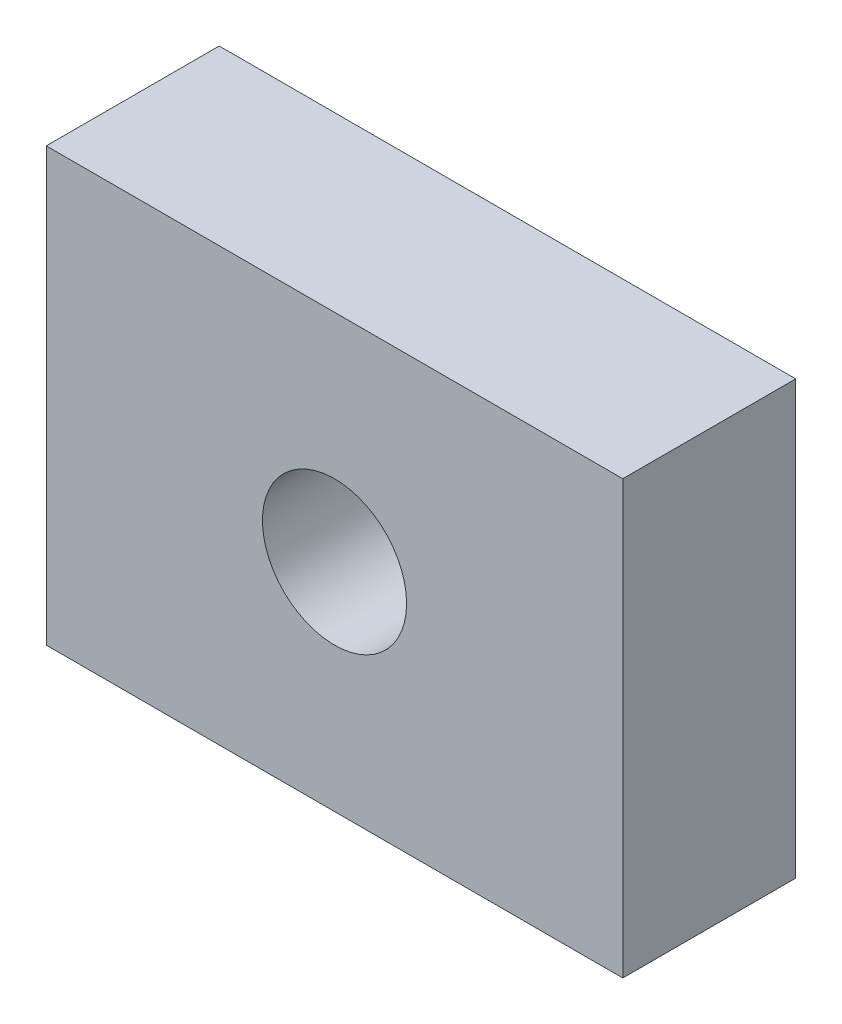
ISO-10303-21;
HEADER;
FILE_DESCRIPTION(('STEP AP214'),'2;1');
FILE_NAME('part.step','',(''),(''),'','','');
FILE_SCHEMA(('AUTOMOTIVE_DESIGN { 1 0 10303 214 1 1 1 1 }'));
ENDSEC;
DATA;
#1=APPLICATION_CONTEXT('core data for automotive mechanical design processes');
#2=APPLICATION_PROTOCOL_DEFINITION('international standard','automotive_design',2000,#1);
#3=PRODUCT_CONTEXT('',#1,'mechanical');
#4=PRODUCT('Part','Part','',(#3));
#5=PRODUCT_RELATED_PRODUCT_CATEGORY('part','',(#4));
#6=PRODUCT_DEFINITION_FORMATION('','',#4);
#7=PRODUCT_DEFINITION_CONTEXT('part definition',#1,'design');
#8=PRODUCT_DEFINITION('design','',#6,#7);
#9=PRODUCT_DEFINITION_SHAPE('','',#8);
#10=(LENGTH_UNIT() NAMED_UNIT(*) SI_UNIT(.MILLI.,.METRE.));
#11=(NAMED_UNIT(*) PLANE_ANGLE_UNIT() SI_UNIT($,.RADIAN.));
#12=(NAMED_UNIT(*) SI_UNIT($,.STERADIAN.) SOLID_ANGLE_UNIT());
#13=UNCERTAINTY_MEASURE_WITH_UNIT(LENGTH_MEASURE(1.E-05),#10,'distance_accuracy_value','');
#14=(GEOMETRIC_REPRESENTATION_CONTEXT(3) GLOBAL_UNCERTAINTY_ASSIGNED_CONTEXT((#13)) GLOBAL_UNIT_ASSIGNED_CONTEXT((#10,
#11,#12)) REPRESENTATION_CONTEXT('',''));
#15=CARTESIAN_POINT('',(0.,0.,0.));
#16=DIRECTION('',(0.,0.,1.));
#17=DIRECTION('',(1.,0.,0.));
#18=AXIS2_PLACEMENT_3D('',#15,#16,#17);
#19=CARTESIAN_POINT('',(-20.,15.,12.));
#20=DIRECTION('',(1.,0.,0.));
#21=DIRECTION('',(0.,0.,-1.));
#22=AXIS2_PLACEMENT_3D('',#19,#20,#21);
#23=PLANE('',#22);
#24=DIRECTION('',(0.,-1.,0.));
#25=VECTOR('',#24,1.);
#26=CARTESIAN_POINT('',(-20.,15.,0.));
#27=LINE('',#26,#25);
#28=CARTESIAN_POINT('',(-20.,15.,0.));
#29=VERTEX_POINT('',#28);
#30=CARTESIAN_POINT('',(-20.,-15.,0.));
#31=VERTEX_POINT('',#30);
#32=EDGE_CURVE('E104',#29,#31,#27,.T.);
#33=ORIENTED_EDGE('',*,*,#32,.T.);
#34=DIRECTION('',(0.,0.,-1.));
#35=VECTOR('',#34,1.);
#36=CARTESIAN_POINT('',(-20.,-15.,12.));
#37=LINE('',#36,#35);
#38=CARTESIAN_POINT('',(-20.,-15.,12.));
#39=VERTEX_POINT('',#38);
#40=EDGE_CURVE('E11',#39,#31,#37,.T.);
#41=ORIENTED_EDGE('',*,*,#40,.F.);
#42=DIRECTION('',(0.,-1.,0.));
#43=VECTOR('',#42,1.);
#44=CARTESIAN_POINT('',(-20.,15.,12.));
#45=LINE('',#44,#43);
#46=CARTESIAN_POINT('',(-20.,15.,12.));
#47=VERTEX_POINT('',#46);
#48=EDGE_CURVE('E92',#47,#39,#45,.T.);
#49=ORIENTED_EDGE('',*,*,#48,.F.);
#50=DIRECTION('',(0.,0.,-1.));
#51=VECTOR('',#50,1.);
#52=CARTESIAN_POINT('',(-20.,15.,12.));
#53=LINE('',#52,#51);
#54=EDGE_CURVE('E100',#47,#29,#53,.T.);
#55=ORIENTED_EDGE('',*,*,#54,.T.);
#56=EDGE_LOOP('',(#33,#41,#49,#55));
#57=FACE_BOUND('',#56,.T.);
#58=ADVANCED_FACE('F41',(#57),#23,.F.);
#59=CARTESIAN_POINT('',(-20.,-15.,12.));
#60=DIRECTION('',(0.,1.,0.));
#61=DIRECTION('',(0.,0.,1.));
#62=AXIS2_PLACEMENT_3D('',#59,#60,#61);
#63=PLANE('',#62);
#64=DIRECTION('',(1.,0.,0.));
#65=VECTOR('',#64,1.);
#66=CARTESIAN_POINT('',(-20.,-15.,0.));
#67=LINE('',#66,#65);
#68=CARTESIAN_POINT('',(20.,-15.,0.));
#69=VERTEX_POINT('',#68);
#70=EDGE_CURVE('E96',#31,#69,#67,.T.);
#71=ORIENTED_EDGE('',*,*,#70,.T.);
#72=DIRECTION('',(0.,0.,-1.));
#73=VECTOR('',#72,1.);
#74=CARTESIAN_POINT('',(20.,-15.,12.));
#75=LINE('',#74,#73);
#76=CARTESIAN_POINT('',(20.,-15.,12.));
#77=VERTEX_POINT('',#76);
#78=EDGE_CURVE('E49',#77,#69,#75,.T.);
#79=ORIENTED_EDGE('',*,*,#78,.F.);
#80=DIRECTION('',(1.,0.,0.));
#81=VECTOR('',#80,1.);
#82=CARTESIAN_POINT('',(-20.,-15.,12.));
#83=LINE('',#82,#81);
#84=EDGE_CURVE('E87',#39,#77,#83,.T.);
#85=ORIENTED_EDGE('',*,*,#84,.F.);
#86=ORIENTED_EDGE('',*,*,#40,.T.);
#87=EDGE_LOOP('',(#71,#79,#85,#86));
#88=FACE_BOUND('',#87,.T.);
#89=ADVANCED_FACE('F95',(#88),#63,.F.);
#90=CARTESIAN_POINT('',(20.,-15.,12.));
#91=DIRECTION('',(-1.,0.,0.));
#92=DIRECTION('',(0.,0.,1.));
#93=AXIS2_PLACEMENT_3D('',#90,#91,#92);
#94=PLANE('',#93);
#95=DIRECTION('',(0.,1.,0.));
#96=VECTOR('',#95,1.);
#97=CARTESIAN_POINT('',(20.,-15.,0.));
#98=LINE('',#97,#96);
#99=CARTESIAN_POINT('',(20.,15.,0.));
#100=VERTEX_POINT('',#99);
#101=EDGE_CURVE('E74',#69,#100,#98,.T.);
#102=ORIENTED_EDGE('',*,*,#101,.T.);
#103=DIRECTION('',(0.,0.,-1.));
#104=VECTOR('',#103,1.);
#105=CARTESIAN_POINT('',(20.,15.,12.));
#106=LINE('',#105,#104);
#107=CARTESIAN_POINT('',(20.,15.,12.));
#108=VERTEX_POINT('',#107);
#109=EDGE_CURVE('E97',#108,#100,#106,.T.);
#110=ORIENTED_EDGE('',*,*,#109,.F.);
#111=DIRECTION('',(0.,1.,0.));
#112=VECTOR('',#111,1.);
#113=CARTESIAN_POINT('',(20.,-15.,12.));
#114=LINE('',#113,#112);
#115=EDGE_CURVE('E90',#77,#108,#114,.T.);
#116=ORIENTED_EDGE('',*,*,#115,.F.);
#117=ORIENTED_EDGE('',*,*,#78,.T.);
#118=EDGE_LOOP('',(#102,#110,#116,#117));
#119=FACE_BOUND('',#118,.T.);
#120=ADVANCED_FACE('F98',(#119),#94,.F.);
#121=CARTESIAN_POINT('',(20.,15.,12.));
#122=DIRECTION('',(0.,-1.,0.));
#123=DIRECTION('',(0.,0.,-1.));
#124=AXIS2_PLACEMENT_3D('',#121,#122,#123);
#125=PLANE('',#124);
#126=DIRECTION('',(-1.,0.,0.));
#127=VECTOR('',#126,1.);
#128=CARTESIAN_POINT('',(20.,15.,0.));
#129=LINE('',#128,#127);
#130=EDGE_CURVE('E80',#100,#29,#129,.T.);
#131=ORIENTED_EDGE('',*,*,#130,.T.);
#132=ORIENTED_EDGE('',*,*,#54,.F.);
#133=DIRECTION('',(-1.,0.,0.));
#134=VECTOR('',#133,1.);
#135=CARTESIAN_POINT('',(20.,15.,12.));
#136=LINE('',#135,#134);
#137=EDGE_CURVE('E57',#108,#47,#136,.T.);
#138=ORIENTED_EDGE('',*,*,#137,.F.);
#139=ORIENTED_EDGE('',*,*,#109,.T.);
#140=EDGE_LOOP('',(#131,#132,#138,#139));
#141=FACE_BOUND('',#140,.T.);
#142=ADVANCED_FACE('F112',(#141),#125,.F.);
#143=CARTESIAN_POINT('',(0.,0.,12.));
#144=DIRECTION('',(0.,0.,1.));
#145=DIRECTION('',(1.,0.,0.));
#146=AXIS2_PLACEMENT_3D('',#143,#144,#145);
#147=PLANE('',#146);
#148=CARTESIAN_POINT('',(0.,0.,12.));
#149=DIRECTION('',(0.,0.,1.));
#150=DIRECTION('',(1.,0.,0.));
#151=AXIS2_PLACEMENT_3D('',#148,#149,#150);
#152=CIRCLE('',#151,5.);
#153=CARTESIAN_POINT('',(5.,0.,12.));
#154=VERTEX_POINT('',#153);
#155=EDGE_CURVE('E118',#154,#154,#152,.T.);
#156=ORIENTED_EDGE('',*,*,#155,.F.);
#157=EDGE_LOOP('',(#156));
#158=FACE_BOUND('',#157,.T.);
#159=ORIENTED_EDGE('',*,*,#48,.T.);
#160=ORIENTED_EDGE('',*,*,#84,.T.);
#161=ORIENTED_EDGE('',*,*,#115,.T.);
#162=ORIENTED_EDGE('',*,*,#137,.T.);
#163=EDGE_LOOP('',(#159,#160,#161,#162));
#164=FACE_BOUND('',#163,.T.);
#165=ADVANCED_FACE('F88',(#158,#164),#147,.T.);
#166=CARTESIAN_POINT('',(0.,0.,0.));
#167=DIRECTION('',(0.,0.,1.));
#168=DIRECTION('',(1.,0.,0.));
#169=AXIS2_PLACEMENT_3D('',#166,#167,#168);
#170=PLANE('',#169);
#171=CARTESIAN_POINT('',(0.,0.,0.));
#172=DIRECTION('',(0.,0.,1.));
#173=DIRECTION('',(1.,0.,0.));
#174=AXIS2_PLACEMENT_3D('',#171,#172,#173);
#175=CIRCLE('',#174,5.);
#176=CARTESIAN_POINT('',(5.,0.,0.));
#177=VERTEX_POINT('',#176);
#178=EDGE_CURVE('E107',#177,#177,#175,.T.);
#179=ORIENTED_EDGE('',*,*,#178,.T.);
#180=EDGE_LOOP('',(#179));
#181=FACE_BOUND('',#180,.T.);
#182=ORIENTED_EDGE('',*,*,#32,.F.);
#183=ORIENTED_EDGE('',*,*,#130,.F.);
#184=ORIENTED_EDGE('',*,*,#101,.F.);
#185=ORIENTED_EDGE('',*,*,#70,.F.);
#186=EDGE_LOOP('',(#182,#183,#184,#185));
#187=FACE_BOUND('',#186,.T.);
#188=ADVANCED_FACE('F115',(#181,#187),#170,.F.);
#189=CARTESIAN_POINT('',(0.,0.,0.));
#190=DIRECTION('',(0.,0.,1.));
#191=DIRECTION('',(1.,0.,0.));
#192=AXIS2_PLACEMENT_3D('',#189,#190,#191);
#193=CYLINDRICAL_SURFACE('',#192,5.);
#194=ORIENTED_EDGE('',*,*,#178,.F.);
#195=EDGE_LOOP('',(#194));
#196=FACE_BOUND('',#195,.T.);
#197=ORIENTED_EDGE('',*,*,#155,.T.);
#198=EDGE_LOOP('',(#197));
#199=FACE_BOUND('',#198,.T.);
#200=ADVANCED_FACE('F125',(#196,#199),#193,.F.);
#201=CLOSED_SHELL('',(#58,#89,#120,#142,#165,#188,#200));
#202=MANIFOLD_SOLID_BREP('B2',#201);
#203=ADVANCED_BREP_SHAPE_REPRESENTATION('',(#18,#202),#14);
#204=SHAPE_DEFINITION_REPRESENTATION(#9,#203);
ENDSEC;
END-ISO-10303-21;
